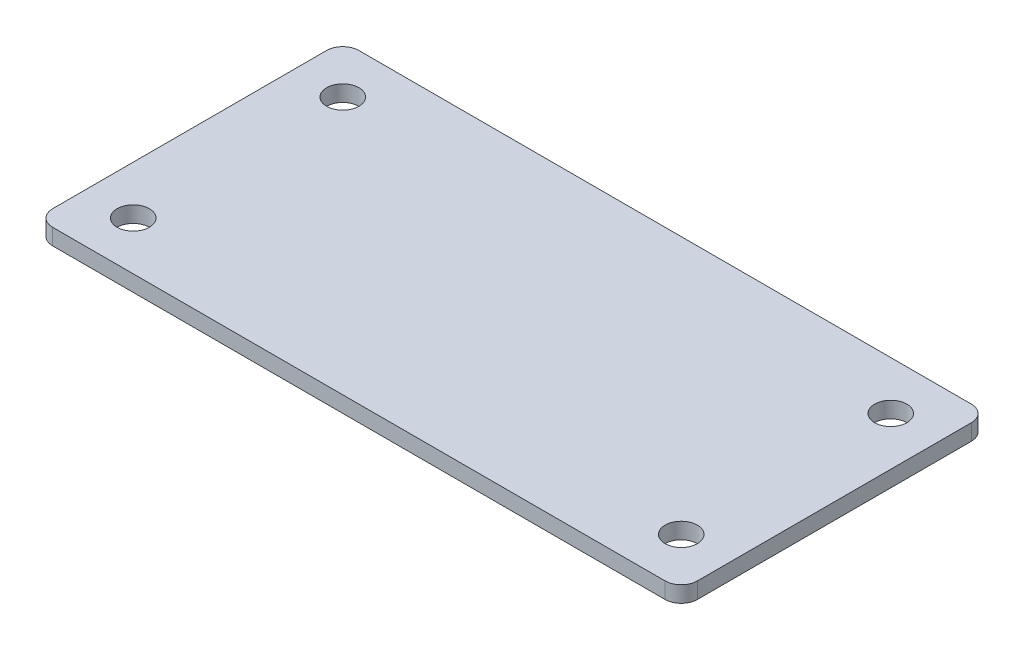
ISO-10303-21;
HEADER;
FILE_DESCRIPTION(('STEP AP214'),'2;1');
FILE_NAME('part.step','',(''),(''),'','','');
FILE_SCHEMA(('AUTOMOTIVE_DESIGN { 1 0 10303 214 1 1 1 1 }'));
ENDSEC;
DATA;
#1=APPLICATION_CONTEXT('core data for automotive mechanical design processes');
#2=APPLICATION_PROTOCOL_DEFINITION('international standard','automotive_design',2000,#1);
#3=PRODUCT_CONTEXT('',#1,'mechanical');
#4=PRODUCT('Part','Part','',(#3));
#5=PRODUCT_RELATED_PRODUCT_CATEGORY('part','',(#4));
#6=PRODUCT_DEFINITION_FORMATION('','',#4);
#7=PRODUCT_DEFINITION_CONTEXT('part definition',#1,'design');
#8=PRODUCT_DEFINITION('design','',#6,#7);
#9=PRODUCT_DEFINITION_SHAPE('','',#8);
#10=(LENGTH_UNIT() NAMED_UNIT(*) SI_UNIT(.MILLI.,.METRE.));
#11=(NAMED_UNIT(*) PLANE_ANGLE_UNIT() SI_UNIT($,.RADIAN.));
#12=(NAMED_UNIT(*) SI_UNIT($,.STERADIAN.) SOLID_ANGLE_UNIT());
#13=UNCERTAINTY_MEASURE_WITH_UNIT(LENGTH_MEASURE(1.E-05),#10,'distance_accuracy_value','');
#14=(GEOMETRIC_REPRESENTATION_CONTEXT(3) GLOBAL_UNCERTAINTY_ASSIGNED_CONTEXT((#13)) GLOBAL_UNIT_ASSIGNED_CONTEXT((#10,
#11,#12)) REPRESENTATION_CONTEXT('',''));
#15=CARTESIAN_POINT('',(0.,0.,0.));
#16=DIRECTION('',(0.,0.,1.));
#17=DIRECTION('',(1.,0.,0.));
#18=AXIS2_PLACEMENT_3D('',#15,#16,#17);
#19=CARTESIAN_POINT('',(-19.,1.,8.5));
#20=DIRECTION('',(0.,-1.,0.));
#21=DIRECTION('',(0.,0.,-1.));
#22=AXIS2_PLACEMENT_3D('',#19,#20,#21);
#23=CYLINDRICAL_SURFACE('',#22,1.);
#24=CARTESIAN_POINT('',(-19.,0.,8.5));
#25=DIRECTION('',(0.,1.,0.));
#26=DIRECTION('',(0.,0.,1.));
#27=AXIS2_PLACEMENT_3D('',#24,#25,#26);
#28=CIRCLE('',#27,1.);
#29=CARTESIAN_POINT('',(-20.,0.,8.5));
#30=VERTEX_POINT('',#29);
#31=CARTESIAN_POINT('',(-19.,0.,9.5));
#32=VERTEX_POINT('',#31);
#33=EDGE_CURVE('E182',#30,#32,#28,.T.);
#34=ORIENTED_EDGE('',*,*,#33,.T.);
#35=DIRECTION('',(0.,-1.,0.));
#36=VECTOR('',#35,1.);
#37=CARTESIAN_POINT('',(-19.,1.,9.5));
#38=LINE('',#37,#36);
#39=CARTESIAN_POINT('',(-19.,1.,9.5));
#40=VERTEX_POINT('',#39);
#41=EDGE_CURVE('E77',#40,#32,#38,.T.);
#42=ORIENTED_EDGE('',*,*,#41,.F.);
#43=CARTESIAN_POINT('',(-19.,1.,8.5));
#44=DIRECTION('',(0.,1.,0.));
#45=DIRECTION('',(0.,0.,1.));
#46=AXIS2_PLACEMENT_3D('',#43,#44,#45);
#47=CIRCLE('',#46,1.);
#48=CARTESIAN_POINT('',(-20.,1.,8.5));
#49=VERTEX_POINT('',#48);
#50=EDGE_CURVE('E215',#49,#40,#47,.T.);
#51=ORIENTED_EDGE('',*,*,#50,.F.);
#52=DIRECTION('',(0.,-1.,0.));
#53=VECTOR('',#52,1.);
#54=CARTESIAN_POINT('',(-20.,1.,8.5));
#55=LINE('',#54,#53);
#56=EDGE_CURVE('E12',#49,#30,#55,.T.);
#57=ORIENTED_EDGE('',*,*,#56,.T.);
#58=EDGE_LOOP('',(#34,#42,#51,#57));
#59=FACE_BOUND('',#58,.T.);
#60=ADVANCED_FACE('F68',(#59),#23,.T.);
#61=CARTESIAN_POINT('',(0.,1.,9.5));
#62=DIRECTION('',(0.,0.,1.));
#63=DIRECTION('',(1.,0.,0.));
#64=AXIS2_PLACEMENT_3D('',#61,#62,#63);
#65=PLANE('',#64);
#66=DIRECTION('',(-1.,0.,0.));
#67=VECTOR('',#66,1.);
#68=CARTESIAN_POINT('',(0.,0.,9.5));
#69=LINE('',#68,#67);
#70=CARTESIAN_POINT('',(19.,0.,9.49999999999999));
#71=VERTEX_POINT('',#70);
#72=EDGE_CURVE('E176',#71,#32,#69,.T.);
#73=ORIENTED_EDGE('',*,*,#72,.F.);
#74=DIRECTION('',(0.,-1.,0.));
#75=VECTOR('',#74,1.);
#76=CARTESIAN_POINT('',(19.,1.,9.49999999999999));
#77=LINE('',#76,#75);
#78=CARTESIAN_POINT('',(19.,1.,9.49999999999999));
#79=VERTEX_POINT('',#78);
#80=EDGE_CURVE('E168',#79,#71,#77,.T.);
#81=ORIENTED_EDGE('',*,*,#80,.F.);
#82=DIRECTION('',(-1.,0.,0.));
#83=VECTOR('',#82,1.);
#84=CARTESIAN_POINT('',(0.,1.,9.5));
#85=LINE('',#84,#83);
#86=EDGE_CURVE('E179',#79,#40,#85,.T.);
#87=ORIENTED_EDGE('',*,*,#86,.T.);
#88=ORIENTED_EDGE('',*,*,#41,.T.);
#89=EDGE_LOOP('',(#73,#81,#87,#88));
#90=FACE_BOUND('',#89,.T.);
#91=ADVANCED_FACE('F174',(#90),#65,.T.);
#92=CARTESIAN_POINT('',(19.,1.,8.49999999999999));
#93=DIRECTION('',(0.,-1.,0.));
#94=DIRECTION('',(0.,0.,-1.));
#95=AXIS2_PLACEMENT_3D('',#92,#93,#94);
#96=CYLINDRICAL_SURFACE('',#95,1.);
#97=CARTESIAN_POINT('',(19.,0.,8.49999999999999));
#98=DIRECTION('',(0.,1.,0.));
#99=DIRECTION('',(0.,0.,1.));
#100=AXIS2_PLACEMENT_3D('',#97,#98,#99);
#101=CIRCLE('',#100,1.);
#102=CARTESIAN_POINT('',(20.,0.,8.49999999999999));
#103=VERTEX_POINT('',#102);
#104=EDGE_CURVE('E188',#103,#71,#101,.F.);
#105=ORIENTED_EDGE('',*,*,#104,.F.);
#106=DIRECTION('',(0.,-1.,0.));
#107=VECTOR('',#106,1.);
#108=CARTESIAN_POINT('',(20.,1.,8.49999999999999));
#109=LINE('',#108,#107);
#110=CARTESIAN_POINT('',(20.,1.,8.49999999999999));
#111=VERTEX_POINT('',#110);
#112=EDGE_CURVE('E162',#111,#103,#109,.T.);
#113=ORIENTED_EDGE('',*,*,#112,.F.);
#114=CARTESIAN_POINT('',(19.,1.,8.49999999999999));
#115=DIRECTION('',(0.,1.,0.));
#116=DIRECTION('',(0.,0.,1.));
#117=AXIS2_PLACEMENT_3D('',#114,#115,#116);
#118=CIRCLE('',#117,1.);
#119=EDGE_CURVE('E218',#111,#79,#118,.F.);
#120=ORIENTED_EDGE('',*,*,#119,.T.);
#121=ORIENTED_EDGE('',*,*,#80,.T.);
#122=EDGE_LOOP('',(#105,#113,#120,#121));
#123=FACE_BOUND('',#122,.T.);
#124=ADVANCED_FACE('F222',(#123),#96,.T.);
#125=CARTESIAN_POINT('',(20.,1.,0.));
#126=DIRECTION('',(-1.,0.,0.));
#127=DIRECTION('',(0.,0.,1.));
#128=AXIS2_PLACEMENT_3D('',#125,#126,#127);
#129=PLANE('',#128);
#130=DIRECTION('',(0.,0.,-1.));
#131=VECTOR('',#130,1.);
#132=CARTESIAN_POINT('',(20.,0.,0.));
#133=LINE('',#132,#131);
#134=CARTESIAN_POINT('',(20.,0.,-8.5));
#135=VERTEX_POINT('',#134);
#136=EDGE_CURVE('E190',#103,#135,#133,.T.);
#137=ORIENTED_EDGE('',*,*,#136,.T.);
#138=DIRECTION('',(0.,-1.,0.));
#139=VECTOR('',#138,1.);
#140=CARTESIAN_POINT('',(20.,1.,-8.5));
#141=LINE('',#140,#139);
#142=CARTESIAN_POINT('',(20.,1.,-8.5));
#143=VERTEX_POINT('',#142);
#144=EDGE_CURVE('E160',#143,#135,#141,.T.);
#145=ORIENTED_EDGE('',*,*,#144,.F.);
#146=DIRECTION('',(0.,0.,-1.));
#147=VECTOR('',#146,1.);
#148=CARTESIAN_POINT('',(20.,1.,0.));
#149=LINE('',#148,#147);
#150=EDGE_CURVE('E153',#111,#143,#149,.T.);
#151=ORIENTED_EDGE('',*,*,#150,.F.);
#152=ORIENTED_EDGE('',*,*,#112,.T.);
#153=EDGE_LOOP('',(#137,#145,#151,#152));
#154=FACE_BOUND('',#153,.T.);
#155=ADVANCED_FACE('F241',(#154),#129,.F.);
#156=CARTESIAN_POINT('',(19.,1.,-8.5));
#157=DIRECTION('',(0.,-1.,0.));
#158=DIRECTION('',(0.,0.,-1.));
#159=AXIS2_PLACEMENT_3D('',#156,#157,#158);
#160=CYLINDRICAL_SURFACE('',#159,1.);
#161=CARTESIAN_POINT('',(19.,0.,-8.5));
#162=DIRECTION('',(0.,1.,0.));
#163=DIRECTION('',(0.,0.,1.));
#164=AXIS2_PLACEMENT_3D('',#161,#162,#163);
#165=CIRCLE('',#164,1.);
#166=CARTESIAN_POINT('',(19.,0.,-9.50000000000001));
#167=VERTEX_POINT('',#166);
#168=EDGE_CURVE('E159',#135,#167,#165,.T.);
#169=ORIENTED_EDGE('',*,*,#168,.T.);
#170=DIRECTION('',(0.,-1.,0.));
#171=VECTOR('',#170,1.);
#172=CARTESIAN_POINT('',(19.,1.,-9.50000000000001));
#173=LINE('',#172,#171);
#174=CARTESIAN_POINT('',(19.,1.,-9.50000000000001));
#175=VERTEX_POINT('',#174);
#176=EDGE_CURVE('E144',#175,#167,#173,.T.);
#177=ORIENTED_EDGE('',*,*,#176,.F.);
#178=CARTESIAN_POINT('',(19.,1.,-8.5));
#179=DIRECTION('',(0.,1.,0.));
#180=DIRECTION('',(0.,0.,1.));
#181=AXIS2_PLACEMENT_3D('',#178,#179,#180);
#182=CIRCLE('',#181,1.);
#183=EDGE_CURVE('E147',#143,#175,#182,.T.);
#184=ORIENTED_EDGE('',*,*,#183,.F.);
#185=ORIENTED_EDGE('',*,*,#144,.T.);
#186=EDGE_LOOP('',(#169,#177,#184,#185));
#187=FACE_BOUND('',#186,.T.);
#188=ADVANCED_FACE('F158',(#187),#160,.T.);
#189=CARTESIAN_POINT('',(0.,1.,-9.5));
#190=DIRECTION('',(0.,0.,1.));
#191=DIRECTION('',(1.,0.,0.));
#192=AXIS2_PLACEMENT_3D('',#189,#190,#191);
#193=PLANE('',#192);
#194=DIRECTION('',(-1.,0.,0.));
#195=VECTOR('',#194,1.);
#196=CARTESIAN_POINT('',(0.,0.,-9.5));
#197=LINE('',#196,#195);
#198=CARTESIAN_POINT('',(-19.,0.,-9.5));
#199=VERTEX_POINT('',#198);
#200=EDGE_CURVE('E197',#167,#199,#197,.T.);
#201=ORIENTED_EDGE('',*,*,#200,.T.);
#202=DIRECTION('',(0.,-1.,0.));
#203=VECTOR('',#202,1.);
#204=CARTESIAN_POINT('',(-19.,1.,-9.5));
#205=LINE('',#204,#203);
#206=CARTESIAN_POINT('',(-19.,1.,-9.5));
#207=VERTEX_POINT('',#206);
#208=EDGE_CURVE('E146',#207,#199,#205,.T.);
#209=ORIENTED_EDGE('',*,*,#208,.F.);
#210=DIRECTION('',(-1.,0.,0.));
#211=VECTOR('',#210,1.);
#212=CARTESIAN_POINT('',(0.,1.,-9.5));
#213=LINE('',#212,#211);
#214=EDGE_CURVE('E139',#175,#207,#213,.T.);
#215=ORIENTED_EDGE('',*,*,#214,.F.);
#216=ORIENTED_EDGE('',*,*,#176,.T.);
#217=EDGE_LOOP('',(#201,#209,#215,#216));
#218=FACE_BOUND('',#217,.T.);
#219=ADVANCED_FACE('F142',(#218),#193,.F.);
#220=CARTESIAN_POINT('',(-19.,1.,-8.5));
#221=DIRECTION('',(0.,-1.,0.));
#222=DIRECTION('',(0.,0.,-1.));
#223=AXIS2_PLACEMENT_3D('',#220,#221,#222);
#224=CYLINDRICAL_SURFACE('',#223,1.);
#225=CARTESIAN_POINT('',(-19.,0.,-8.5));
#226=DIRECTION('',(0.,1.,0.));
#227=DIRECTION('',(0.,0.,1.));
#228=AXIS2_PLACEMENT_3D('',#225,#226,#227);
#229=CIRCLE('',#228,1.);
#230=CARTESIAN_POINT('',(-20.,0.,-8.5));
#231=VERTEX_POINT('',#230);
#232=EDGE_CURVE('E112',#199,#231,#229,.T.);
#233=ORIENTED_EDGE('',*,*,#232,.T.);
#234=DIRECTION('',(0.,-1.,0.));
#235=VECTOR('',#234,1.);
#236=CARTESIAN_POINT('',(-20.,1.,-8.5));
#237=LINE('',#236,#235);
#238=CARTESIAN_POINT('',(-20.,1.,-8.5));
#239=VERTEX_POINT('',#238);
#240=EDGE_CURVE('E119',#239,#231,#237,.T.);
#241=ORIENTED_EDGE('',*,*,#240,.F.);
#242=CARTESIAN_POINT('',(-19.,1.,-8.5));
#243=DIRECTION('',(0.,1.,0.));
#244=DIRECTION('',(0.,0.,1.));
#245=AXIS2_PLACEMENT_3D('',#242,#243,#244);
#246=CIRCLE('',#245,1.);
#247=EDGE_CURVE('E85',#207,#239,#246,.T.);
#248=ORIENTED_EDGE('',*,*,#247,.F.);
#249=ORIENTED_EDGE('',*,*,#208,.T.);
#250=EDGE_LOOP('',(#233,#241,#248,#249));
#251=FACE_BOUND('',#250,.T.);
#252=ADVANCED_FACE('F224',(#251),#224,.T.);
#253=CARTESIAN_POINT('',(-20.,1.,0.));
#254=DIRECTION('',(-1.,0.,0.));
#255=DIRECTION('',(0.,0.,1.));
#256=AXIS2_PLACEMENT_3D('',#253,#254,#255);
#257=PLANE('',#256);
#258=DIRECTION('',(0.,0.,-1.));
#259=VECTOR('',#258,1.);
#260=CARTESIAN_POINT('',(-20.,0.,0.));
#261=LINE('',#260,#259);
#262=EDGE_CURVE('E183',#30,#231,#261,.T.);
#263=ORIENTED_EDGE('',*,*,#262,.F.);
#264=ORIENTED_EDGE('',*,*,#56,.F.);
#265=DIRECTION('',(0.,0.,-1.));
#266=VECTOR('',#265,1.);
#267=CARTESIAN_POINT('',(-20.,1.,0.));
#268=LINE('',#267,#266);
#269=EDGE_CURVE('E199',#49,#239,#268,.T.);
#270=ORIENTED_EDGE('',*,*,#269,.T.);
#271=ORIENTED_EDGE('',*,*,#240,.T.);
#272=EDGE_LOOP('',(#263,#264,#270,#271));
#273=FACE_BOUND('',#272,.T.);
#274=ADVANCED_FACE('F70',(#273),#257,.T.);
#275=CARTESIAN_POINT('',(0.,0.,0.));
#276=DIRECTION('',(0.,1.,0.));
#277=DIRECTION('',(0.,0.,1.));
#278=AXIS2_PLACEMENT_3D('',#275,#276,#277);
#279=PLANE('',#278);
#280=CARTESIAN_POINT('',(-17.,0.,-6.5));
#281=DIRECTION('',(0.,-1.,0.));
#282=DIRECTION('',(0.,0.,1.));
#283=AXIS2_PLACEMENT_3D('',#280,#281,#282);
#284=CIRCLE('',#283,1.);
#285=CARTESIAN_POINT('',(-17.,0.,-5.5));
#286=VERTEX_POINT('',#285);
#287=EDGE_CURVE('E275',#286,#286,#284,.T.);
#288=ORIENTED_EDGE('',*,*,#287,.F.);
#289=EDGE_LOOP('',(#288));
#290=FACE_BOUND('',#289,.T.);
#291=CARTESIAN_POINT('',(-17.,0.,6.49999999999999));
#292=DIRECTION('',(0.,1.,0.));
#293=DIRECTION('',(0.,0.,-1.));
#294=AXIS2_PLACEMENT_3D('',#291,#292,#293);
#295=CIRCLE('',#294,1.);
#296=CARTESIAN_POINT('',(-17.,0.,5.49999999999999));
#297=VERTEX_POINT('',#296);
#298=EDGE_CURVE('E277',#297,#297,#295,.T.);
#299=ORIENTED_EDGE('',*,*,#298,.T.);
#300=EDGE_LOOP('',(#299));
#301=FACE_BOUND('',#300,.T.);
#302=CARTESIAN_POINT('',(17.,0.,-6.5));
#303=DIRECTION('',(0.,1.,0.));
#304=DIRECTION('',(0.,0.,1.));
#305=AXIS2_PLACEMENT_3D('',#302,#303,#304);
#306=CIRCLE('',#305,1.);
#307=CARTESIAN_POINT('',(17.,0.,-5.5));
#308=VERTEX_POINT('',#307);
#309=EDGE_CURVE('E211',#308,#308,#306,.T.);
#310=ORIENTED_EDGE('',*,*,#309,.T.);
#311=EDGE_LOOP('',(#310));
#312=FACE_BOUND('',#311,.T.);
#313=CARTESIAN_POINT('',(17.,0.,6.49999999999999));
#314=DIRECTION('',(0.,-1.,0.));
#315=DIRECTION('',(0.,0.,-1.));
#316=AXIS2_PLACEMENT_3D('',#313,#314,#315);
#317=CIRCLE('',#316,1.);
#318=CARTESIAN_POINT('',(17.,0.,5.49999999999999));
#319=VERTEX_POINT('',#318);
#320=EDGE_CURVE('E203',#319,#319,#317,.T.);
#321=ORIENTED_EDGE('',*,*,#320,.F.);
#322=EDGE_LOOP('',(#321));
#323=FACE_BOUND('',#322,.T.);
#324=ORIENTED_EDGE('',*,*,#262,.T.);
#325=ORIENTED_EDGE('',*,*,#232,.F.);
#326=ORIENTED_EDGE('',*,*,#200,.F.);
#327=ORIENTED_EDGE('',*,*,#168,.F.);
#328=ORIENTED_EDGE('',*,*,#136,.F.);
#329=ORIENTED_EDGE('',*,*,#104,.T.);
#330=ORIENTED_EDGE('',*,*,#72,.T.);
#331=ORIENTED_EDGE('',*,*,#33,.F.);
#332=EDGE_LOOP('',(#324,#325,#326,#327,#328,#329,#330,#331));
#333=FACE_BOUND('',#332,.T.);
#334=ADVANCED_FACE('F185',(#290,#301,#312,#323,#333),#279,.F.);
#335=CARTESIAN_POINT('',(0.,1.,0.));
#336=DIRECTION('',(0.,1.,0.));
#337=DIRECTION('',(0.,0.,1.));
#338=AXIS2_PLACEMENT_3D('',#335,#336,#337);
#339=PLANE('',#338);
#340=CARTESIAN_POINT('',(-17.,1.,-6.5));
#341=DIRECTION('',(0.,-1.,0.));
#342=DIRECTION('',(0.,0.,1.));
#343=AXIS2_PLACEMENT_3D('',#340,#341,#342);
#344=CIRCLE('',#343,1.);
#345=CARTESIAN_POINT('',(-17.,1.,-5.5));
#346=VERTEX_POINT('',#345);
#347=EDGE_CURVE('E272',#346,#346,#344,.T.);
#348=ORIENTED_EDGE('',*,*,#347,.T.);
#349=EDGE_LOOP('',(#348));
#350=FACE_BOUND('',#349,.T.);
#351=CARTESIAN_POINT('',(-17.,1.,6.49999999999999));
#352=DIRECTION('',(0.,1.,0.));
#353=DIRECTION('',(0.,0.,-1.));
#354=AXIS2_PLACEMENT_3D('',#351,#352,#353);
#355=CIRCLE('',#354,1.);
#356=CARTESIAN_POINT('',(-17.,1.,5.49999999999999));
#357=VERTEX_POINT('',#356);
#358=EDGE_CURVE('E280',#357,#357,#355,.T.);
#359=ORIENTED_EDGE('',*,*,#358,.F.);
#360=EDGE_LOOP('',(#359));
#361=FACE_BOUND('',#360,.T.);
#362=CARTESIAN_POINT('',(17.,1.,-6.5));
#363=DIRECTION('',(0.,1.,0.));
#364=DIRECTION('',(0.,0.,1.));
#365=AXIS2_PLACEMENT_3D('',#362,#363,#364);
#366=CIRCLE('',#365,1.);
#367=CARTESIAN_POINT('',(17.,1.,-5.5));
#368=VERTEX_POINT('',#367);
#369=EDGE_CURVE('E208',#368,#368,#366,.T.);
#370=ORIENTED_EDGE('',*,*,#369,.F.);
#371=EDGE_LOOP('',(#370));
#372=FACE_BOUND('',#371,.T.);
#373=CARTESIAN_POINT('',(17.,1.,6.49999999999999));
#374=DIRECTION('',(0.,-1.,0.));
#375=DIRECTION('',(0.,0.,-1.));
#376=AXIS2_PLACEMENT_3D('',#373,#374,#375);
#377=CIRCLE('',#376,1.);
#378=CARTESIAN_POINT('',(17.,1.,5.49999999999999));
#379=VERTEX_POINT('',#378);
#380=EDGE_CURVE('E201',#379,#379,#377,.T.);
#381=ORIENTED_EDGE('',*,*,#380,.T.);
#382=EDGE_LOOP('',(#381));
#383=FACE_BOUND('',#382,.T.);
#384=ORIENTED_EDGE('',*,*,#269,.F.);
#385=ORIENTED_EDGE('',*,*,#50,.T.);
#386=ORIENTED_EDGE('',*,*,#86,.F.);
#387=ORIENTED_EDGE('',*,*,#119,.F.);
#388=ORIENTED_EDGE('',*,*,#150,.T.);
#389=ORIENTED_EDGE('',*,*,#183,.T.);
#390=ORIENTED_EDGE('',*,*,#214,.T.);
#391=ORIENTED_EDGE('',*,*,#247,.T.);
#392=EDGE_LOOP('',(#384,#385,#386,#387,#388,#389,#390,#391));
#393=FACE_BOUND('',#392,.T.);
#394=ADVANCED_FACE('F150',(#350,#361,#372,#383,#393),#339,.T.);
#395=CARTESIAN_POINT('',(17.,1.,6.49999999999999));
#396=DIRECTION('',(0.,-1.,0.));
#397=DIRECTION('',(0.,0.,-1.));
#398=AXIS2_PLACEMENT_3D('',#395,#396,#397);
#399=CYLINDRICAL_SURFACE('',#398,1.);
#400=ORIENTED_EDGE('',*,*,#380,.F.);
#401=EDGE_LOOP('',(#400));
#402=FACE_BOUND('',#401,.T.);
#403=ORIENTED_EDGE('',*,*,#320,.T.);
#404=EDGE_LOOP('',(#403));
#405=FACE_BOUND('',#404,.T.);
#406=ADVANCED_FACE('F251',(#402,#405),#399,.F.);
#407=CARTESIAN_POINT('',(17.,1.,-6.5));
#408=DIRECTION('',(0.,-1.,0.));
#409=DIRECTION('',(0.,0.,-1.));
#410=AXIS2_PLACEMENT_3D('',#407,#408,#409);
#411=CYLINDRICAL_SURFACE('',#410,1.);
#412=ORIENTED_EDGE('',*,*,#369,.T.);
#413=EDGE_LOOP('',(#412));
#414=FACE_BOUND('',#413,.T.);
#415=ORIENTED_EDGE('',*,*,#309,.F.);
#416=EDGE_LOOP('',(#415));
#417=FACE_BOUND('',#416,.T.);
#418=ADVANCED_FACE('F255',(#414,#417),#411,.F.);
#419=CARTESIAN_POINT('',(-17.,1.,6.49999999999999));
#420=DIRECTION('',(0.,-1.,0.));
#421=DIRECTION('',(0.,0.,-1.));
#422=AXIS2_PLACEMENT_3D('',#419,#420,#421);
#423=CYLINDRICAL_SURFACE('',#422,1.);
#424=ORIENTED_EDGE('',*,*,#358,.T.);
#425=EDGE_LOOP('',(#424));
#426=FACE_BOUND('',#425,.T.);
#427=ORIENTED_EDGE('',*,*,#298,.F.);
#428=EDGE_LOOP('',(#427));
#429=FACE_BOUND('',#428,.T.);
#430=ADVANCED_FACE('F259',(#426,#429),#423,.F.);
#431=CARTESIAN_POINT('',(-17.,1.,-6.5));
#432=DIRECTION('',(0.,-1.,0.));
#433=DIRECTION('',(0.,0.,-1.));
#434=AXIS2_PLACEMENT_3D('',#431,#432,#433);
#435=CYLINDRICAL_SURFACE('',#434,1.);
#436=ORIENTED_EDGE('',*,*,#347,.F.);
#437=EDGE_LOOP('',(#436));
#438=FACE_BOUND('',#437,.T.);
#439=ORIENTED_EDGE('',*,*,#287,.T.);
#440=EDGE_LOOP('',(#439));
#441=FACE_BOUND('',#440,.T.);
#442=ADVANCED_FACE('F263',(#438,#441),#435,.F.);
#443=CLOSED_SHELL('',(#60,#91,#124,#155,#188,#219,#252,#274,#334,#394,#406,#418,#430,#442));
#444=MANIFOLD_SOLID_BREP('B2',#443);
#445=ADVANCED_BREP_SHAPE_REPRESENTATION('',(#18,#444),#14);
#446=SHAPE_DEFINITION_REPRESENTATION(#9,#445);
ENDSEC;
END-ISO-10303-21;
